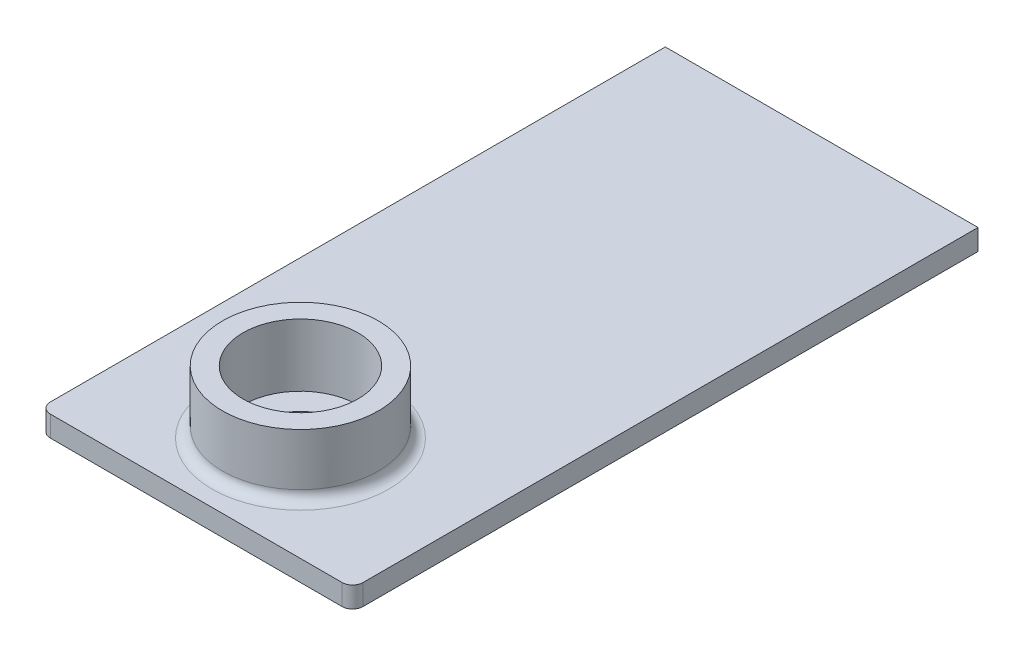
ISO-10303-21;
HEADER;
FILE_DESCRIPTION(('STEP AP214'),'2;1');
FILE_NAME('part.step','',(''),(''),'','','');
FILE_SCHEMA(('AUTOMOTIVE_DESIGN { 1 0 10303 214 1 1 1 1 }'));
ENDSEC;
DATA;
#1=APPLICATION_CONTEXT('core data for automotive mechanical design processes');
#2=APPLICATION_PROTOCOL_DEFINITION('international standard','automotive_design',2000,#1);
#3=PRODUCT_CONTEXT('',#1,'mechanical');
#4=PRODUCT('Part','Part','',(#3));
#5=PRODUCT_RELATED_PRODUCT_CATEGORY('part','',(#4));
#6=PRODUCT_DEFINITION_FORMATION('','',#4);
#7=PRODUCT_DEFINITION_CONTEXT('part definition',#1,'design');
#8=PRODUCT_DEFINITION('design','',#6,#7);
#9=PRODUCT_DEFINITION_SHAPE('','',#8);
#10=(LENGTH_UNIT() NAMED_UNIT(*) SI_UNIT(.MILLI.,.METRE.));
#11=(NAMED_UNIT(*) PLANE_ANGLE_UNIT() SI_UNIT($,.RADIAN.));
#12=(NAMED_UNIT(*) SI_UNIT($,.STERADIAN.) SOLID_ANGLE_UNIT());
#13=UNCERTAINTY_MEASURE_WITH_UNIT(LENGTH_MEASURE(1.E-05),#10,'distance_accuracy_value','');
#14=(GEOMETRIC_REPRESENTATION_CONTEXT(3) GLOBAL_UNCERTAINTY_ASSIGNED_CONTEXT((#13)) GLOBAL_UNIT_ASSIGNED_CONTEXT((#10,
#11,#12)) REPRESENTATION_CONTEXT('',''));
#15=CARTESIAN_POINT('',(0.,0.,0.));
#16=DIRECTION('',(0.,0.,1.));
#17=DIRECTION('',(1.,0.,0.));
#18=AXIS2_PLACEMENT_3D('',#15,#16,#17);
#19=CARTESIAN_POINT('',(38.1,1.27,-76.2));
#20=DIRECTION('',(0.,0.,1.));
#21=DIRECTION('',(1.,0.,0.));
#22=AXIS2_PLACEMENT_3D('',#19,#20,#21);
#23=PLANE('',#22);
#24=DIRECTION('',(-1.,0.,0.));
#25=VECTOR('',#24,1.);
#26=CARTESIAN_POINT('',(38.1,-1.27,-76.2));
#27=LINE('',#26,#25);
#28=CARTESIAN_POINT('',(38.1,-1.27,-76.2));
#29=VERTEX_POINT('',#28);
#30=CARTESIAN_POINT('',(0.,-1.27,-76.2));
#31=VERTEX_POINT('',#30);
#32=EDGE_CURVE('E117',#29,#31,#27,.T.);
#33=ORIENTED_EDGE('',*,*,#32,.T.);
#34=DIRECTION('',(0.,-1.,0.));
#35=VECTOR('',#34,1.);
#36=CARTESIAN_POINT('',(0.,1.27,-76.2));
#37=LINE('',#36,#35);
#38=CARTESIAN_POINT('',(0.,1.27,-76.2));
#39=VERTEX_POINT('',#38);
#40=EDGE_CURVE('E98',#39,#31,#37,.T.);
#41=ORIENTED_EDGE('',*,*,#40,.F.);
#42=DIRECTION('',(-1.,0.,0.));
#43=VECTOR('',#42,1.);
#44=CARTESIAN_POINT('',(38.1,1.27,-76.2));
#45=LINE('',#44,#43);
#46=CARTESIAN_POINT('',(38.1,1.27,-76.2));
#47=VERTEX_POINT('',#46);
#48=EDGE_CURVE('E104',#47,#39,#45,.T.);
#49=ORIENTED_EDGE('',*,*,#48,.F.);
#50=DIRECTION('',(0.,-1.,0.));
#51=VECTOR('',#50,1.);
#52=CARTESIAN_POINT('',(38.1,1.27,-76.2));
#53=LINE('',#52,#51);
#54=EDGE_CURVE('E120',#47,#29,#53,.T.);
#55=ORIENTED_EDGE('',*,*,#54,.T.);
#56=EDGE_LOOP('',(#33,#41,#49,#55));
#57=FACE_BOUND('',#56,.T.);
#58=ADVANCED_FACE('F41',(#57),#23,.F.);
#59=CARTESIAN_POINT('',(0.,1.27,-76.2));
#60=DIRECTION('',(1.,0.,0.));
#61=DIRECTION('',(0.,0.,-1.));
#62=AXIS2_PLACEMENT_3D('',#59,#60,#61);
#63=PLANE('',#62);
#64=DIRECTION('',(0.,0.,1.));
#65=VECTOR('',#64,1.);
#66=CARTESIAN_POINT('',(0.,-1.27,-76.2));
#67=LINE('',#66,#65);
#68=CARTESIAN_POINT('',(0.,-1.27,-1.27000000000002));
#69=VERTEX_POINT('',#68);
#70=EDGE_CURVE('E178',#31,#69,#67,.T.);
#71=ORIENTED_EDGE('',*,*,#70,.T.);
#72=DIRECTION('',(0.,-1.,0.));
#73=VECTOR('',#72,1.);
#74=CARTESIAN_POINT('',(0.,1.27,-1.26999999999999));
#75=LINE('',#74,#73);
#76=CARTESIAN_POINT('',(0.,1.27,-1.27000000000002));
#77=VERTEX_POINT('',#76);
#78=EDGE_CURVE('E11',#69,#77,#75,.F.);
#79=ORIENTED_EDGE('',*,*,#78,.T.);
#80=DIRECTION('',(0.,0.,1.));
#81=VECTOR('',#80,1.);
#82=CARTESIAN_POINT('',(0.,1.27,-76.2));
#83=LINE('',#82,#81);
#84=EDGE_CURVE('E94',#39,#77,#83,.T.);
#85=ORIENTED_EDGE('',*,*,#84,.F.);
#86=ORIENTED_EDGE('',*,*,#40,.T.);
#87=EDGE_LOOP('',(#71,#79,#85,#86));
#88=FACE_BOUND('',#87,.T.);
#89=ADVANCED_FACE('F96',(#88),#63,.F.);
#90=CARTESIAN_POINT('',(0.,1.27,0.));
#91=DIRECTION('',(0.,0.,-1.));
#92=DIRECTION('',(-1.,0.,0.));
#93=AXIS2_PLACEMENT_3D('',#90,#91,#92);
#94=PLANE('',#93);
#95=DIRECTION('',(1.,0.,0.));
#96=VECTOR('',#95,1.);
#97=CARTESIAN_POINT('',(0.,-1.27,0.));
#98=LINE('',#97,#96);
#99=CARTESIAN_POINT('',(1.27,-1.27,0.));
#100=VERTEX_POINT('',#99);
#101=CARTESIAN_POINT('',(36.83,-1.27,0.));
#102=VERTEX_POINT('',#101);
#103=EDGE_CURVE('E174',#100,#102,#98,.T.);
#104=ORIENTED_EDGE('',*,*,#103,.T.);
#105=DIRECTION('',(0.,-1.,0.));
#106=VECTOR('',#105,1.);
#107=CARTESIAN_POINT('',(36.83,1.27,0.));
#108=LINE('',#107,#106);
#109=CARTESIAN_POINT('',(36.83,1.27,0.));
#110=VERTEX_POINT('',#109);
#111=EDGE_CURVE('E63',#102,#110,#108,.F.);
#112=ORIENTED_EDGE('',*,*,#111,.T.);
#113=DIRECTION('',(1.,0.,0.));
#114=VECTOR('',#113,1.);
#115=CARTESIAN_POINT('',(0.,1.27,0.));
#116=LINE('',#115,#114);
#117=CARTESIAN_POINT('',(1.27,1.27,0.));
#118=VERTEX_POINT('',#117);
#119=EDGE_CURVE('E103',#118,#110,#116,.T.);
#120=ORIENTED_EDGE('',*,*,#119,.F.);
#121=DIRECTION('',(0.,-1.,0.));
#122=VECTOR('',#121,1.);
#123=CARTESIAN_POINT('',(1.27,1.27,0.));
#124=LINE('',#123,#122);
#125=EDGE_CURVE('E153',#118,#100,#124,.T.);
#126=ORIENTED_EDGE('',*,*,#125,.T.);
#127=EDGE_LOOP('',(#104,#112,#120,#126));
#128=FACE_BOUND('',#127,.T.);
#129=ADVANCED_FACE('F175',(#128),#94,.F.);
#130=CARTESIAN_POINT('',(38.1,1.27,0.));
#131=DIRECTION('',(-1.,0.,0.));
#132=DIRECTION('',(0.,0.,1.));
#133=AXIS2_PLACEMENT_3D('',#130,#131,#132);
#134=PLANE('',#133);
#135=DIRECTION('',(0.,0.,-1.));
#136=VECTOR('',#135,1.);
#137=CARTESIAN_POINT('',(38.1,1.27,0.));
#138=LINE('',#137,#136);
#139=CARTESIAN_POINT('',(38.1,1.27,-1.27));
#140=VERTEX_POINT('',#139);
#141=EDGE_CURVE('E109',#140,#47,#138,.T.);
#142=ORIENTED_EDGE('',*,*,#141,.F.);
#143=DIRECTION('',(0.,-1.,0.));
#144=VECTOR('',#143,1.);
#145=CARTESIAN_POINT('',(38.1,1.27,-1.27));
#146=LINE('',#145,#144);
#147=CARTESIAN_POINT('',(38.1,-1.27,-1.27));
#148=VERTEX_POINT('',#147);
#149=EDGE_CURVE('E143',#140,#148,#146,.T.);
#150=ORIENTED_EDGE('',*,*,#149,.T.);
#151=DIRECTION('',(0.,0.,-1.));
#152=VECTOR('',#151,1.);
#153=CARTESIAN_POINT('',(38.1,-1.27,0.));
#154=LINE('',#153,#152);
#155=EDGE_CURVE('E114',#148,#29,#154,.T.);
#156=ORIENTED_EDGE('',*,*,#155,.T.);
#157=ORIENTED_EDGE('',*,*,#54,.F.);
#158=EDGE_LOOP('',(#142,#150,#156,#157));
#159=FACE_BOUND('',#158,.T.);
#160=ADVANCED_FACE('F166',(#159),#134,.F.);
#161=CARTESIAN_POINT('',(0.,1.27,0.));
#162=DIRECTION('',(0.,1.,0.));
#163=DIRECTION('',(0.,0.,1.));
#164=AXIS2_PLACEMENT_3D('',#161,#162,#163);
#165=PLANE('',#164);
#166=CARTESIAN_POINT('',(19.05,1.27,-12.7));
#167=DIRECTION('',(0.,1.,0.));
#168=DIRECTION('',(0.,0.,1.));
#169=AXIS2_PLACEMENT_3D('',#166,#167,#168);
#170=CIRCLE('',#169,10.77);
#171=CARTESIAN_POINT('',(19.05,1.27,-1.93));
#172=VERTEX_POINT('',#171);
#173=EDGE_CURVE('E139',#172,#172,#170,.F.);
#174=ORIENTED_EDGE('',*,*,#173,.T.);
#175=EDGE_LOOP('',(#174));
#176=FACE_BOUND('',#175,.T.);
#177=ORIENTED_EDGE('',*,*,#119,.T.);
#178=CARTESIAN_POINT('',(36.83,1.27,-1.27));
#179=DIRECTION('',(0.,1.,0.));
#180=DIRECTION('',(0.,0.,1.));
#181=AXIS2_PLACEMENT_3D('',#178,#179,#180);
#182=CIRCLE('',#181,1.27);
#183=EDGE_CURVE('E50',#110,#140,#182,.T.);
#184=ORIENTED_EDGE('',*,*,#183,.T.);
#185=ORIENTED_EDGE('',*,*,#141,.T.);
#186=ORIENTED_EDGE('',*,*,#48,.T.);
#187=ORIENTED_EDGE('',*,*,#84,.T.);
#188=CARTESIAN_POINT('',(1.27,1.27,-1.27));
#189=DIRECTION('',(0.,1.,0.));
#190=DIRECTION('',(0.,0.,1.));
#191=AXIS2_PLACEMENT_3D('',#188,#189,#190);
#192=CIRCLE('',#191,1.27);
#193=EDGE_CURVE('E159',#77,#118,#192,.T.);
#194=ORIENTED_EDGE('',*,*,#193,.T.);
#195=EDGE_LOOP('',(#177,#184,#185,#186,#187,#194));
#196=FACE_BOUND('',#195,.T.);
#197=ADVANCED_FACE('F107',(#176,#196),#165,.T.);
#198=CARTESIAN_POINT('',(0.,-1.27,0.));
#199=DIRECTION('',(0.,1.,0.));
#200=DIRECTION('',(0.,0.,1.));
#201=AXIS2_PLACEMENT_3D('',#198,#199,#200);
#202=PLANE('',#201);
#203=CARTESIAN_POINT('',(19.05,-1.27,-12.7));
#204=DIRECTION('',(0.,1.,0.));
#205=DIRECTION('',(0.,0.,1.));
#206=AXIS2_PLACEMENT_3D('',#203,#204,#205);
#207=CIRCLE('',#206,4.);
#208=CARTESIAN_POINT('',(19.05,-1.27,-8.7));
#209=VERTEX_POINT('',#208);
#210=EDGE_CURVE('E130',#209,#209,#207,.T.);
#211=ORIENTED_EDGE('',*,*,#210,.T.);
#212=EDGE_LOOP('',(#211));
#213=FACE_BOUND('',#212,.T.);
#214=ORIENTED_EDGE('',*,*,#155,.F.);
#215=CARTESIAN_POINT('',(36.83,-1.27,-1.27));
#216=DIRECTION('',(0.,1.,0.));
#217=DIRECTION('',(0.,0.,1.));
#218=AXIS2_PLACEMENT_3D('',#215,#216,#217);
#219=CIRCLE('',#218,1.27);
#220=EDGE_CURVE('E150',#148,#102,#219,.F.);
#221=ORIENTED_EDGE('',*,*,#220,.T.);
#222=ORIENTED_EDGE('',*,*,#103,.F.);
#223=CARTESIAN_POINT('',(1.27,-1.27,-1.27));
#224=DIRECTION('',(0.,1.,0.));
#225=DIRECTION('',(0.,0.,1.));
#226=AXIS2_PLACEMENT_3D('',#223,#224,#225);
#227=CIRCLE('',#226,1.27);
#228=EDGE_CURVE('E147',#100,#69,#227,.F.);
#229=ORIENTED_EDGE('',*,*,#228,.T.);
#230=ORIENTED_EDGE('',*,*,#70,.F.);
#231=ORIENTED_EDGE('',*,*,#32,.F.);
#232=EDGE_LOOP('',(#214,#221,#222,#229,#230,#231));
#233=FACE_BOUND('',#232,.T.);
#234=ADVANCED_FACE('F173',(#213,#233),#202,.F.);
#235=CARTESIAN_POINT('',(19.05,8.89,-12.7));
#236=DIRECTION('',(0.,-1.,0.));
#237=DIRECTION('',(0.,0.,-1.));
#238=AXIS2_PLACEMENT_3D('',#235,#236,#237);
#239=CYLINDRICAL_SURFACE('',#238,7.);
#240=CARTESIAN_POINT('',(19.05,8.89,-12.7));
#241=DIRECTION('',(0.,1.,0.));
#242=DIRECTION('',(0.,0.,1.));
#243=AXIS2_PLACEMENT_3D('',#240,#241,#242);
#244=CIRCLE('',#243,7.);
#245=CARTESIAN_POINT('',(19.05,8.89,-19.7));
#246=VERTEX_POINT('',#245);
#247=EDGE_CURVE('E134',#246,#246,#244,.T.);
#248=CARTESIAN_POINT('',(19.05,1.27,-12.7));
#249=DIRECTION('',(0.,1.,0.));
#250=DIRECTION('',(0.,0.,1.));
#251=AXIS2_PLACEMENT_3D('',#248,#249,#250);
#252=CIRCLE('',#251,7.);
#253=CARTESIAN_POINT('',(19.05,1.27,-19.7));
#254=VERTEX_POINT('',#253);
#255=EDGE_CURVE('E119',#254,#254,#252,.F.);
#256=CARTESIAN_POINT('',(19.05,8.89,-19.7));
#257=CARTESIAN_POINT('',(19.05,8.810625,-19.7));
#258=CARTESIAN_POINT('',(19.05,8.73125,-19.7));
#259=CARTESIAN_POINT('',(19.05,8.5725,-19.7));
#260=CARTESIAN_POINT('',(19.05,8.493125,-19.7));
#261=CARTESIAN_POINT('',(19.05,8.334375,-19.7));
#262=CARTESIAN_POINT('',(19.05,8.255,-19.7));
#263=CARTESIAN_POINT('',(19.05,8.09625,-19.7));
#264=CARTESIAN_POINT('',(19.05,8.016875,-19.7));
#265=CARTESIAN_POINT('',(19.05,7.858125,-19.7));
#266=CARTESIAN_POINT('',(19.05,7.77875,-19.7));
#267=CARTESIAN_POINT('',(19.05,7.62,-19.7));
#268=CARTESIAN_POINT('',(19.05,7.540625,-19.7));
#269=CARTESIAN_POINT('',(19.05,7.381875,-19.7));
#270=CARTESIAN_POINT('',(19.05,7.3025,-19.7));
#271=CARTESIAN_POINT('',(19.05,7.14375,-19.7));
#272=CARTESIAN_POINT('',(19.05,7.064375,-19.7));
#273=CARTESIAN_POINT('',(19.05,6.905625,-19.7));
#274=CARTESIAN_POINT('',(19.05,6.82625,-19.7));
#275=CARTESIAN_POINT('',(19.05,6.6675,-19.7));
#276=CARTESIAN_POINT('',(19.05,6.588125,-19.7));
#277=CARTESIAN_POINT('',(19.05,6.429375,-19.7));
#278=CARTESIAN_POINT('',(19.05,6.35,-19.7));
#279=CARTESIAN_POINT('',(19.05,6.19125,-19.7));
#280=CARTESIAN_POINT('',(19.05,6.111875,-19.7));
#281=CARTESIAN_POINT('',(19.05,5.953125,-19.7));
#282=CARTESIAN_POINT('',(19.05,5.87375,-19.7));
#283=CARTESIAN_POINT('',(19.05,5.715,-19.7));
#284=CARTESIAN_POINT('',(19.05,5.635625,-19.7));
#285=CARTESIAN_POINT('',(19.05,5.476875,-19.7));
#286=CARTESIAN_POINT('',(19.05,5.3975,-19.7));
#287=CARTESIAN_POINT('',(19.05,5.23875,-19.7));
#288=CARTESIAN_POINT('',(19.05,5.159375,-19.7));
#289=CARTESIAN_POINT('',(19.05,5.000625,-19.7));
#290=CARTESIAN_POINT('',(19.05,4.92125,-19.7));
#291=CARTESIAN_POINT('',(19.05,4.7625,-19.7));
#292=CARTESIAN_POINT('',(19.05,4.683125,-19.7));
#293=CARTESIAN_POINT('',(19.05,4.524375,-19.7));
#294=CARTESIAN_POINT('',(19.05,4.445,-19.7));
#295=CARTESIAN_POINT('',(19.05,4.28625,-19.7));
#296=CARTESIAN_POINT('',(19.05,4.206875,-19.7));
#297=CARTESIAN_POINT('',(19.05,4.048125,-19.7));
#298=CARTESIAN_POINT('',(19.05,3.96875,-19.7));
#299=CARTESIAN_POINT('',(19.05,3.81,-19.7));
#300=CARTESIAN_POINT('',(19.05,3.730625,-19.7));
#301=CARTESIAN_POINT('',(19.05,3.571875,-19.7));
#302=CARTESIAN_POINT('',(19.05,3.4925,-19.7));
#303=CARTESIAN_POINT('',(19.05,3.33375,-19.7));
#304=CARTESIAN_POINT('',(19.05,3.254375,-19.7));
#305=CARTESIAN_POINT('',(19.05,3.095625,-19.7));
#306=CARTESIAN_POINT('',(19.05,3.01625,-19.7));
#307=CARTESIAN_POINT('',(19.05,2.8575,-19.7));
#308=CARTESIAN_POINT('',(19.05,2.778125,-19.7));
#309=CARTESIAN_POINT('',(19.05,2.619375,-19.7));
#310=CARTESIAN_POINT('',(19.05,2.54,-19.7));
#311=CARTESIAN_POINT('',(19.05,2.38125,-19.7));
#312=CARTESIAN_POINT('',(19.05,2.301875,-19.7));
#313=CARTESIAN_POINT('',(19.05,2.143125,-19.7));
#314=CARTESIAN_POINT('',(19.05,2.06375,-19.7));
#315=CARTESIAN_POINT('',(19.05,1.905,-19.7));
#316=CARTESIAN_POINT('',(19.05,1.825625,-19.7));
#317=CARTESIAN_POINT('',(19.05,1.666875,-19.7));
#318=CARTESIAN_POINT('',(19.05,1.5875,-19.7));
#319=CARTESIAN_POINT('',(19.05,1.42875,-19.7));
#320=CARTESIAN_POINT('',(19.05,1.349375,-19.7));
#321=CARTESIAN_POINT('',(19.05,1.27,-19.7));
#322=B_SPLINE_CURVE_WITH_KNOTS('',3,(#256,#257,#258,#259,#260,#261,#262,#263,#264,#265,#266,
#267,#268,#269,#270,#271,#272,#273,#274,#275,#276,#277,#278,#279,#280,#281,#282,#283,#284,#285,
#286,#287,#288,#289,#290,#291,#292,#293,#294,#295,#296,#297,#298,#299,#300,#301,#302,#303,#304,
#305,#306,#307,#308,#309,#310,#311,#312,#313,#314,#315,#316,#317,#318,#319,#320,#321),
.UNSPECIFIED.,.F.,.F.,(4,2,2,2,2,2,2,2,2,2,2,2,2,2,2,2,2,2,2,2,2,2,2,2,2,2,2,2,2,2,2,2,4),(0.,
0.238124999999999,0.476249999999999,0.714375,0.952499999999998,1.190625,1.42875,1.666875,1.905,
2.143125,2.38125,2.619375,2.8575,3.095625,3.33375,3.571875,3.81,4.048125,4.28625,4.524375,
4.7625,5.000625,5.23875,5.476875,5.715,5.953125,6.19125,6.429375,6.6675,6.905625,7.14375,
7.381875,7.62),.UNSPECIFIED.);
#323=EDGE_CURVE('BSEAM209',#246,#254,#322,.T.);
#324=ORIENTED_EDGE('',*,*,#247,.T.);
#325=ORIENTED_EDGE('',*,*,#255,.T.);
#326=ORIENTED_EDGE('',*,*,#323,.T.);
#327=ORIENTED_EDGE('',*,*,#323,.F.);
#328=EDGE_LOOP('',(#324,#326,#325,#327));
#329=FACE_BOUND('',#328,.T.);
#330=ADVANCED_FACE('F209',(#329),#239,.F.);
#331=CARTESIAN_POINT('',(19.05,8.89,-12.7));
#332=DIRECTION('',(0.,-1.,0.));
#333=DIRECTION('',(0.,0.,-1.));
#334=AXIS2_PLACEMENT_3D('',#331,#332,#333);
#335=CYLINDRICAL_SURFACE('',#334,9.5);
#336=CARTESIAN_POINT('',(19.05,2.54,-12.7));
#337=DIRECTION('',(0.,1.,0.));
#338=DIRECTION('',(0.,0.,1.));
#339=AXIS2_PLACEMENT_3D('',#336,#337,#338);
#340=CIRCLE('',#339,9.5);
#341=CARTESIAN_POINT('',(19.05,2.54,-22.2));
#342=VERTEX_POINT('',#341);
#343=EDGE_CURVE('E125',#342,#342,#340,.T.);
#344=CARTESIAN_POINT('',(19.05,8.89,-12.7));
#345=DIRECTION('',(0.,1.,0.));
#346=DIRECTION('',(0.,0.,1.));
#347=AXIS2_PLACEMENT_3D('',#344,#345,#346);
#348=CIRCLE('',#347,9.5);
#349=CARTESIAN_POINT('',(19.05,8.89,-22.2));
#350=VERTEX_POINT('',#349);
#351=EDGE_CURVE('E185',#350,#350,#348,.T.);
#352=CARTESIAN_POINT('',(19.05,2.54,-22.2));
#353=CARTESIAN_POINT('',(19.05,2.60614583333333,-22.2));
#354=CARTESIAN_POINT('',(19.05,2.67229166666667,-22.2));
#355=CARTESIAN_POINT('',(19.05,2.80458333333333,-22.2));
#356=CARTESIAN_POINT('',(19.05,2.87072916666667,-22.2));
#357=CARTESIAN_POINT('',(19.05,3.00302083333333,-22.2));
#358=CARTESIAN_POINT('',(19.05,3.06916666666667,-22.2));
#359=CARTESIAN_POINT('',(19.05,3.20145833333333,-22.2));
#360=CARTESIAN_POINT('',(19.05,3.26760416666667,-22.2));
#361=CARTESIAN_POINT('',(19.05,3.39989583333333,-22.2));
#362=CARTESIAN_POINT('',(19.05,3.46604166666667,-22.2));
#363=CARTESIAN_POINT('',(19.05,3.59833333333333,-22.2));
#364=CARTESIAN_POINT('',(19.05,3.66447916666667,-22.2));
#365=CARTESIAN_POINT('',(19.05,3.79677083333333,-22.2));
#366=CARTESIAN_POINT('',(19.05,3.86291666666667,-22.2));
#367=CARTESIAN_POINT('',(19.05,3.99520833333333,-22.2));
#368=CARTESIAN_POINT('',(19.05,4.06135416666667,-22.2));
#369=CARTESIAN_POINT('',(19.05,4.19364583333333,-22.2));
#370=CARTESIAN_POINT('',(19.05,4.25979166666667,-22.2));
#371=CARTESIAN_POINT('',(19.05,4.39208333333333,-22.2));
#372=CARTESIAN_POINT('',(19.05,4.45822916666667,-22.2));
#373=CARTESIAN_POINT('',(19.05,4.59052083333333,-22.2));
#374=CARTESIAN_POINT('',(19.05,4.65666666666667,-22.2));
#375=CARTESIAN_POINT('',(19.05,4.78895833333333,-22.2));
#376=CARTESIAN_POINT('',(19.05,4.85510416666667,-22.2));
#377=CARTESIAN_POINT('',(19.05,4.98739583333333,-22.2));
#378=CARTESIAN_POINT('',(19.05,5.05354166666667,-22.2));
#379=CARTESIAN_POINT('',(19.05,5.18583333333333,-22.2));
#380=CARTESIAN_POINT('',(19.05,5.25197916666666,-22.2));
#381=CARTESIAN_POINT('',(19.05,5.38427083333333,-22.2));
#382=CARTESIAN_POINT('',(19.05,5.45041666666666,-22.2));
#383=CARTESIAN_POINT('',(19.05,5.58270833333333,-22.2));
#384=CARTESIAN_POINT('',(19.05,5.64885416666667,-22.2));
#385=CARTESIAN_POINT('',(19.05,5.78114583333333,-22.2));
#386=CARTESIAN_POINT('',(19.05,5.84729166666667,-22.2));
#387=CARTESIAN_POINT('',(19.05,5.97958333333333,-22.2));
#388=CARTESIAN_POINT('',(19.05,6.04572916666667,-22.2));
#389=CARTESIAN_POINT('',(19.05,6.17802083333333,-22.2));
#390=CARTESIAN_POINT('',(19.05,6.24416666666666,-22.2));
#391=CARTESIAN_POINT('',(19.05,6.37645833333333,-22.2));
#392=CARTESIAN_POINT('',(19.05,6.44260416666666,-22.2));
#393=CARTESIAN_POINT('',(19.05,6.57489583333333,-22.2));
#394=CARTESIAN_POINT('',(19.05,6.64104166666666,-22.2));
#395=CARTESIAN_POINT('',(19.05,6.77333333333333,-22.2));
#396=CARTESIAN_POINT('',(19.05,6.83947916666666,-22.2));
#397=CARTESIAN_POINT('',(19.05,6.97177083333333,-22.2));
#398=CARTESIAN_POINT('',(19.05,7.03791666666667,-22.2));
#399=CARTESIAN_POINT('',(19.05,7.17020833333333,-22.2));
#400=CARTESIAN_POINT('',(19.05,7.23635416666666,-22.2));
#401=CARTESIAN_POINT('',(19.05,7.36864583333333,-22.2));
#402=CARTESIAN_POINT('',(19.05,7.43479166666666,-22.2));
#403=CARTESIAN_POINT('',(19.05,7.56708333333333,-22.2));
#404=CARTESIAN_POINT('',(19.05,7.63322916666666,-22.2));
#405=CARTESIAN_POINT('',(19.05,7.76552083333333,-22.2));
#406=CARTESIAN_POINT('',(19.05,7.83166666666667,-22.2));
#407=CARTESIAN_POINT('',(19.05,7.96395833333333,-22.2));
#408=CARTESIAN_POINT('',(19.05,8.03010416666666,-22.2));
#409=CARTESIAN_POINT('',(19.05,8.16239583333333,-22.2));
#410=CARTESIAN_POINT('',(19.05,8.22854166666666,-22.2));
#411=CARTESIAN_POINT('',(19.05,8.36083333333333,-22.2));
#412=CARTESIAN_POINT('',(19.05,8.42697916666667,-22.2));
#413=CARTESIAN_POINT('',(19.05,8.55927083333333,-22.2));
#414=CARTESIAN_POINT('',(19.05,8.62541666666666,-22.2));
#415=CARTESIAN_POINT('',(19.05,8.75770833333333,-22.2));
#416=CARTESIAN_POINT('',(19.05,8.82385416666667,-22.2));
#417=CARTESIAN_POINT('',(19.05,8.89,-22.2));
#418=B_SPLINE_CURVE_WITH_KNOTS('',3,(#352,#353,#354,#355,#356,#357,#358,#359,#360,#361,#362,
#363,#364,#365,#366,#367,#368,#369,#370,#371,#372,#373,#374,#375,#376,#377,#378,#379,#380,#381,
#382,#383,#384,#385,#386,#387,#388,#389,#390,#391,#392,#393,#394,#395,#396,#397,#398,#399,#400,
#401,#402,#403,#404,#405,#406,#407,#408,#409,#410,#411,#412,#413,#414,#415,#416,#417),
.UNSPECIFIED.,.F.,.F.,(4,2,2,2,2,2,2,2,2,2,2,2,2,2,2,2,2,2,2,2,2,2,2,2,2,2,2,2,2,2,2,2,4),(0.,
0.1984375,0.396875,0.5953125,0.79375,0.9921875,1.190625,1.3890625,1.5875,1.7859375,1.984375,
2.1828125,2.38125,2.5796875,2.778125,2.9765625,3.175,3.3734375,3.571875,3.7703125,3.96875,
4.1671875,4.365625,4.5640625,4.7625,4.9609375,5.159375,5.3578125,5.55625,5.7546875,5.953125,
6.1515625,6.35),.UNSPECIFIED.);
#419=EDGE_CURVE('BSEAM211',#342,#350,#418,.T.);
#420=ORIENTED_EDGE('',*,*,#343,.T.);
#421=ORIENTED_EDGE('',*,*,#351,.F.);
#422=ORIENTED_EDGE('',*,*,#419,.T.);
#423=ORIENTED_EDGE('',*,*,#419,.F.);
#424=EDGE_LOOP('',(#420,#422,#421,#423));
#425=FACE_BOUND('',#424,.T.);
#426=ADVANCED_FACE('F211',(#425),#335,.T.);
#427=CARTESIAN_POINT('',(0.,8.89,0.));
#428=DIRECTION('',(0.,1.,0.));
#429=DIRECTION('',(0.,0.,1.));
#430=AXIS2_PLACEMENT_3D('',#427,#428,#429);
#431=PLANE('',#430);
#432=ORIENTED_EDGE('',*,*,#247,.F.);
#433=EDGE_LOOP('',(#432));
#434=FACE_BOUND('',#433,.T.);
#435=ORIENTED_EDGE('',*,*,#351,.T.);
#436=EDGE_LOOP('',(#435));
#437=FACE_BOUND('',#436,.T.);
#438=ADVANCED_FACE('F205',(#434,#437),#431,.T.);
#439=CARTESIAN_POINT('',(19.05,1.27,-12.7));
#440=DIRECTION('',(0.,1.,0.));
#441=DIRECTION('',(0.,0.,1.));
#442=AXIS2_PLACEMENT_3D('',#439,#440,#441);
#443=CIRCLE('',#442,4.);
#444=CARTESIAN_POINT('',(19.05,1.27,-8.7));
#445=VERTEX_POINT('',#444);
#446=EDGE_CURVE('E135',#445,#445,#443,.T.);
#447=ORIENTED_EDGE('',*,*,#446,.F.);
#448=EDGE_LOOP('',(#447));
#449=FACE_BOUND('',#448,.T.);
#450=ORIENTED_EDGE('',*,*,#255,.F.);
#451=EDGE_LOOP('',(#450));
#452=FACE_BOUND('',#451,.T.);
#453=ADVANCED_FACE('F202',(#449,#452),#165,.T.);
#454=CARTESIAN_POINT('',(19.05,-6.35,-12.7));
#455=DIRECTION('',(0.,1.,0.));
#456=DIRECTION('',(0.,0.,1.));
#457=AXIS2_PLACEMENT_3D('',#454,#455,#456);
#458=CYLINDRICAL_SURFACE('',#457,4.);
#459=CARTESIAN_POINT('',(19.05,1.27,-8.7));
#460=CARTESIAN_POINT('',(19.05,1.24354166666667,-8.7));
#461=CARTESIAN_POINT('',(19.05,1.21708333333333,-8.7));
#462=CARTESIAN_POINT('',(19.05,1.16416666666667,-8.7));
#463=CARTESIAN_POINT('',(19.05,1.13770833333333,-8.7));
#464=CARTESIAN_POINT('',(19.05,1.08479166666667,-8.7));
#465=CARTESIAN_POINT('',(19.05,1.05833333333333,-8.7));
#466=CARTESIAN_POINT('',(19.05,1.00541666666667,-8.7));
#467=CARTESIAN_POINT('',(19.05,0.978958333333333,-8.7));
#468=CARTESIAN_POINT('',(19.05,0.926041666666667,-8.7));
#469=CARTESIAN_POINT('',(19.05,0.899583333333334,-8.7));
#470=CARTESIAN_POINT('',(19.05,0.846666666666667,-8.7));
#471=CARTESIAN_POINT('',(19.05,0.820208333333334,-8.7));
#472=CARTESIAN_POINT('',(19.05,0.767291666666667,-8.7));
#473=CARTESIAN_POINT('',(19.05,0.740833333333333,-8.7));
#474=CARTESIAN_POINT('',(19.05,0.687916666666667,-8.7));
#475=CARTESIAN_POINT('',(19.05,0.661458333333333,-8.7));
#476=CARTESIAN_POINT('',(19.05,0.608541666666667,-8.7));
#477=CARTESIAN_POINT('',(19.05,0.582083333333334,-8.7));
#478=CARTESIAN_POINT('',(19.05,0.529166666666667,-8.7));
#479=CARTESIAN_POINT('',(19.05,0.502708333333334,-8.7));
#480=CARTESIAN_POINT('',(19.05,0.449791666666667,-8.7));
#481=CARTESIAN_POINT('',(19.05,0.423333333333333,-8.7));
#482=CARTESIAN_POINT('',(19.05,0.370416666666666,-8.7));
#483=CARTESIAN_POINT('',(19.05,0.343958333333333,-8.7));
#484=CARTESIAN_POINT('',(19.05,0.291041666666667,-8.7));
#485=CARTESIAN_POINT('',(19.05,0.264583333333334,-8.7));
#486=CARTESIAN_POINT('',(19.05,0.211666666666667,-8.7));
#487=CARTESIAN_POINT('',(19.05,0.185208333333334,-8.7));
#488=CARTESIAN_POINT('',(19.05,0.132291666666667,-8.7));
#489=CARTESIAN_POINT('',(19.05,0.105833333333333,-8.7));
#490=CARTESIAN_POINT('',(19.05,0.0529166666666664,-8.7));
#491=CARTESIAN_POINT('',(19.05,0.0264583333333332,-8.7));
#492=CARTESIAN_POINT('',(19.05,-0.0264583333333332,-8.7));
#493=CARTESIAN_POINT('',(19.05,-0.0529166666666664,-8.7));
#494=CARTESIAN_POINT('',(19.05,-0.105833333333333,-8.7));
#495=CARTESIAN_POINT('',(19.05,-0.132291666666667,-8.7));
#496=CARTESIAN_POINT('',(19.05,-0.185208333333334,-8.7));
#497=CARTESIAN_POINT('',(19.05,-0.211666666666667,-8.7));
#498=CARTESIAN_POINT('',(19.05,-0.264583333333334,-8.7));
#499=CARTESIAN_POINT('',(19.05,-0.291041666666667,-8.7));
#500=CARTESIAN_POINT('',(19.05,-0.343958333333333,-8.7));
#501=CARTESIAN_POINT('',(19.05,-0.370416666666666,-8.7));
#502=CARTESIAN_POINT('',(19.05,-0.423333333333333,-8.7));
#503=CARTESIAN_POINT('',(19.05,-0.449791666666667,-8.7));
#504=CARTESIAN_POINT('',(19.05,-0.502708333333334,-8.7));
#505=CARTESIAN_POINT('',(19.05,-0.529166666666667,-8.7));
#506=CARTESIAN_POINT('',(19.05,-0.582083333333334,-8.7));
#507=CARTESIAN_POINT('',(19.05,-0.608541666666667,-8.7));
#508=CARTESIAN_POINT('',(19.05,-0.661458333333333,-8.7));
#509=CARTESIAN_POINT('',(19.05,-0.687916666666667,-8.7));
#510=CARTESIAN_POINT('',(19.05,-0.740833333333333,-8.7));
#511=CARTESIAN_POINT('',(19.05,-0.767291666666667,-8.7));
#512=CARTESIAN_POINT('',(19.05,-0.820208333333334,-8.7));
#513=CARTESIAN_POINT('',(19.05,-0.846666666666667,-8.7));
#514=CARTESIAN_POINT('',(19.05,-0.899583333333334,-8.7));
#515=CARTESIAN_POINT('',(19.05,-0.926041666666667,-8.7));
#516=CARTESIAN_POINT('',(19.05,-0.978958333333333,-8.7));
#517=CARTESIAN_POINT('',(19.05,-1.00541666666667,-8.7));
#518=CARTESIAN_POINT('',(19.05,-1.05833333333333,-8.7));
#519=CARTESIAN_POINT('',(19.05,-1.08479166666667,-8.7));
#520=CARTESIAN_POINT('',(19.05,-1.13770833333333,-8.7));
#521=CARTESIAN_POINT('',(19.05,-1.16416666666667,-8.7));
#522=CARTESIAN_POINT('',(19.05,-1.21708333333333,-8.7));
#523=CARTESIAN_POINT('',(19.05,-1.24354166666667,-8.7));
#524=CARTESIAN_POINT('',(19.05,-1.27,-8.7));
#525=B_SPLINE_CURVE_WITH_KNOTS('',3,(#459,#460,#461,#462,#463,#464,#465,#466,#467,#468,#469,
#470,#471,#472,#473,#474,#475,#476,#477,#478,#479,#480,#481,#482,#483,#484,#485,#486,#487,#488,
#489,#490,#491,#492,#493,#494,#495,#496,#497,#498,#499,#500,#501,#502,#503,#504,#505,#506,#507,
#508,#509,#510,#511,#512,#513,#514,#515,#516,#517,#518,#519,#520,#521,#522,#523,#524),
.UNSPECIFIED.,.F.,.F.,(4,2,2,2,2,2,2,2,2,2,2,2,2,2,2,2,2,2,2,2,2,2,2,2,2,2,2,2,2,2,2,2,4),(0.,
0.0793749999999996,0.15875,0.238125,0.3175,0.396875,0.47625,0.555625000000001,0.635,0.714375,
0.79375,0.873125000000001,0.9525,1.031875,1.11125,1.190625,1.27,1.349375,1.42875,1.508125,
1.5875,1.666875,1.74625,1.825625,1.905,1.984375,2.06375,2.143125,2.2225,2.301875,2.38125,
2.460625,2.54),.UNSPECIFIED.);
#526=EDGE_CURVE('BSEAM199',#445,#209,#525,.T.);
#527=ORIENTED_EDGE('',*,*,#446,.T.);
#528=ORIENTED_EDGE('',*,*,#210,.F.);
#529=ORIENTED_EDGE('',*,*,#526,.T.);
#530=ORIENTED_EDGE('',*,*,#526,.F.);
#531=EDGE_LOOP('',(#527,#529,#528,#530));
#532=FACE_BOUND('',#531,.T.);
#533=ADVANCED_FACE('F199',(#532),#458,.F.);
#534=CARTESIAN_POINT('',(19.05,2.54,-12.7));
#535=DIRECTION('',(0.,1.,0.));
#536=DIRECTION('',(0.,0.,1.));
#537=AXIS2_PLACEMENT_3D('',#534,#535,#536);
#538=TOROIDAL_SURFACE('',#537,10.77,1.27);
#539=ORIENTED_EDGE('',*,*,#173,.F.);
#540=EDGE_LOOP('',(#539));
#541=FACE_BOUND('',#540,.T.);
#542=ORIENTED_EDGE('',*,*,#343,.F.);
#543=EDGE_LOOP('',(#542));
#544=FACE_BOUND('',#543,.T.);
#545=ADVANCED_FACE('F230',(#541,#544),#538,.F.);
#546=CARTESIAN_POINT('',(36.83,1.27,-1.27));
#547=DIRECTION('',(0.,-1.,0.));
#548=DIRECTION('',(0.,0.,-1.));
#549=AXIS2_PLACEMENT_3D('',#546,#547,#548);
#550=CYLINDRICAL_SURFACE('',#549,1.27);
#551=ORIENTED_EDGE('',*,*,#183,.F.);
#552=ORIENTED_EDGE('',*,*,#111,.F.);
#553=ORIENTED_EDGE('',*,*,#220,.F.);
#554=ORIENTED_EDGE('',*,*,#149,.F.);
#555=EDGE_LOOP('',(#551,#552,#553,#554));
#556=FACE_BOUND('',#555,.T.);
#557=ADVANCED_FACE('F170',(#556),#550,.T.);
#558=CARTESIAN_POINT('',(1.27,1.27,-1.27));
#559=DIRECTION('',(0.,-1.,0.));
#560=DIRECTION('',(0.,0.,-1.));
#561=AXIS2_PLACEMENT_3D('',#558,#559,#560);
#562=CYLINDRICAL_SURFACE('',#561,1.27);
#563=ORIENTED_EDGE('',*,*,#193,.F.);
#564=ORIENTED_EDGE('',*,*,#78,.F.);
#565=ORIENTED_EDGE('',*,*,#228,.F.);
#566=ORIENTED_EDGE('',*,*,#125,.F.);
#567=EDGE_LOOP('',(#563,#564,#565,#566));
#568=FACE_BOUND('',#567,.T.);
#569=ADVANCED_FACE('F43',(#568),#562,.T.);
#570=CLOSED_SHELL('',(#58,#89,#129,#160,#197,#234,#330,#426,#438,#453,#533,#545,#557,#569));
#571=MANIFOLD_SOLID_BREP('B2',#570);
#572=ADVANCED_BREP_SHAPE_REPRESENTATION('',(#18,#571),#14);
#573=SHAPE_DEFINITION_REPRESENTATION(#9,#572);
ENDSEC;
END-ISO-10303-21;
